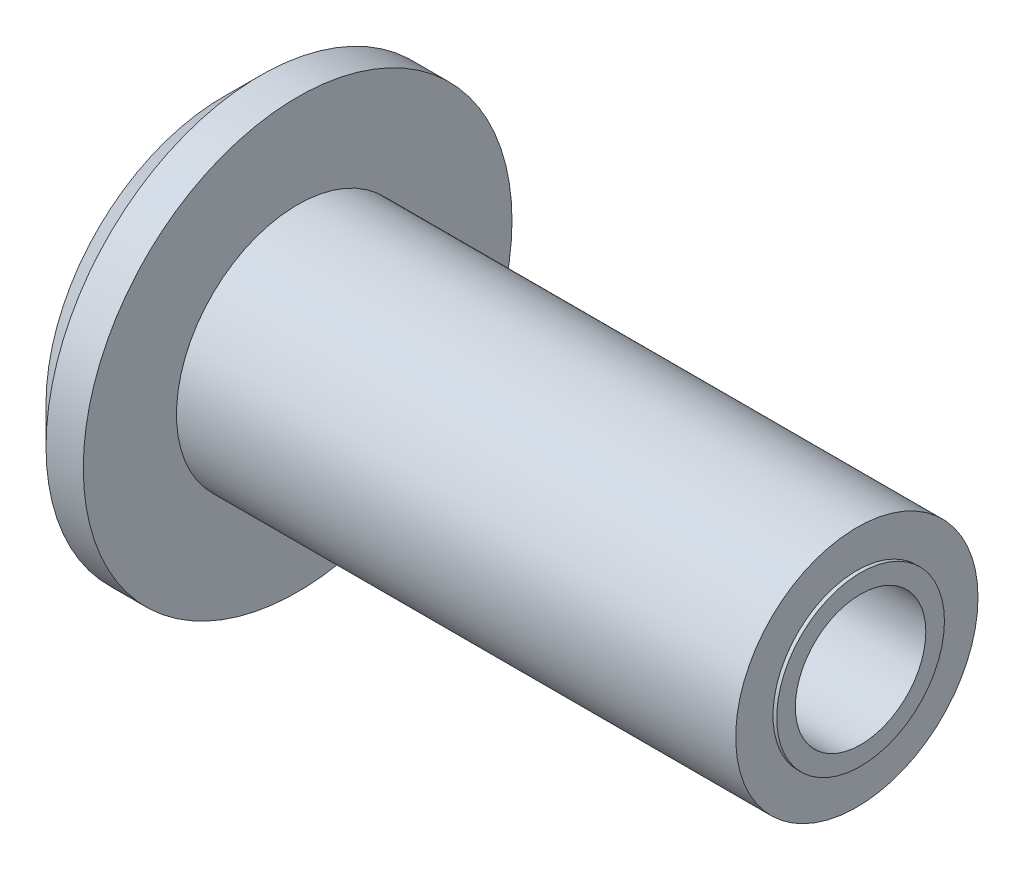
ISO-10303-21;
HEADER;
FILE_DESCRIPTION(('STEP AP214'),'2;1');
FILE_NAME('part.step','',(''),(''),'','','');
FILE_SCHEMA(('AUTOMOTIVE_DESIGN { 1 0 10303 214 1 1 1 1 }'));
ENDSEC;
DATA;
#1=APPLICATION_CONTEXT('core data for automotive mechanical design processes');
#2=APPLICATION_PROTOCOL_DEFINITION('international standard','automotive_design',2000,#1);
#3=PRODUCT_CONTEXT('',#1,'mechanical');
#4=PRODUCT('Part','Part','',(#3));
#5=PRODUCT_RELATED_PRODUCT_CATEGORY('part','',(#4));
#6=PRODUCT_DEFINITION_FORMATION('','',#4);
#7=PRODUCT_DEFINITION_CONTEXT('part definition',#1,'design');
#8=PRODUCT_DEFINITION('design','',#6,#7);
#9=PRODUCT_DEFINITION_SHAPE('','',#8);
#10=(LENGTH_UNIT() NAMED_UNIT(*) SI_UNIT(.MILLI.,.METRE.));
#11=(NAMED_UNIT(*) PLANE_ANGLE_UNIT() SI_UNIT($,.RADIAN.));
#12=(NAMED_UNIT(*) SI_UNIT($,.STERADIAN.) SOLID_ANGLE_UNIT());
#13=UNCERTAINTY_MEASURE_WITH_UNIT(LENGTH_MEASURE(1.E-05),#10,'distance_accuracy_value','');
#14=(GEOMETRIC_REPRESENTATION_CONTEXT(3) GLOBAL_UNCERTAINTY_ASSIGNED_CONTEXT((#13)) GLOBAL_UNIT_ASSIGNED_CONTEXT((#10,
#11,#12)) REPRESENTATION_CONTEXT('',''));
#15=CARTESIAN_POINT('',(0.,0.,0.));
#16=DIRECTION('',(0.,0.,1.));
#17=DIRECTION('',(1.,0.,0.));
#18=AXIS2_PLACEMENT_3D('',#15,#16,#17);
#19=CARTESIAN_POINT('',(30.,0.,0.));
#20=DIRECTION('',(1.,0.,0.));
#21=DIRECTION('',(0.,0.,-1.));
#22=AXIS2_PLACEMENT_3D('',#19,#20,#21);
#23=PLANE('',#22);
#24=CARTESIAN_POINT('',(30.,0.,0.));
#25=DIRECTION('',(1.,0.,0.));
#26=DIRECTION('',(0.,0.,-1.));
#27=AXIS2_PLACEMENT_3D('',#24,#25,#26);
#28=CIRCLE('',#27,6.5);
#29=CARTESIAN_POINT('',(30.,0.,-6.5));
#30=VERTEX_POINT('',#29);
#31=EDGE_CURVE('E55',#30,#30,#28,.T.);
#32=ORIENTED_EDGE('',*,*,#31,.T.);
#33=EDGE_LOOP('',(#32));
#34=FACE_BOUND('',#33,.T.);
#35=CARTESIAN_POINT('',(30.,0.,0.));
#36=DIRECTION('',(1.,0.,0.));
#37=DIRECTION('',(0.,0.,-1.));
#38=AXIS2_PLACEMENT_3D('',#35,#36,#37);
#39=CIRCLE('',#38,4.5);
#40=CARTESIAN_POINT('',(30.,0.,-4.5));
#41=VERTEX_POINT('',#40);
#42=EDGE_CURVE('E83',#41,#41,#39,.T.);
#43=ORIENTED_EDGE('',*,*,#42,.F.);
#44=EDGE_LOOP('',(#43));
#45=FACE_BOUND('',#44,.T.);
#46=ADVANCED_FACE('F41',(#34,#45),#23,.T.);
#47=CARTESIAN_POINT('',(30.,0.,0.));
#48=DIRECTION('',(-1.,0.,0.));
#49=DIRECTION('',(0.,0.,1.));
#50=AXIS2_PLACEMENT_3D('',#47,#48,#49);
#51=CYLINDRICAL_SURFACE('',#50,3.5);
#52=CARTESIAN_POINT('',(-2.,0.,0.));
#53=DIRECTION('',(-1.,0.,0.));
#54=DIRECTION('',(0.,0.,1.));
#55=AXIS2_PLACEMENT_3D('',#52,#53,#54);
#56=CIRCLE('',#55,3.5);
#57=CARTESIAN_POINT('',(-2.,0.,3.5));
#58=VERTEX_POINT('',#57);
#59=EDGE_CURVE('E63',#58,#58,#56,.T.);
#60=ORIENTED_EDGE('',*,*,#59,.T.);
#61=EDGE_LOOP('',(#60));
#62=FACE_BOUND('',#61,.T.);
#63=CARTESIAN_POINT('',(30.2,0.,0.));
#64=DIRECTION('',(1.,0.,0.));
#65=DIRECTION('',(0.,0.,-1.));
#66=AXIS2_PLACEMENT_3D('',#63,#64,#65);
#67=CIRCLE('',#66,3.5);
#68=CARTESIAN_POINT('',(30.2,0.,-3.5));
#69=VERTEX_POINT('',#68);
#70=EDGE_CURVE('E87',#69,#69,#67,.T.);
#71=ORIENTED_EDGE('',*,*,#70,.T.);
#72=EDGE_LOOP('',(#71));
#73=FACE_BOUND('',#72,.T.);
#74=ADVANCED_FACE('F95',(#62,#73),#51,.F.);
#75=CARTESIAN_POINT('',(30.,0.,0.));
#76=DIRECTION('',(-1.,0.,0.));
#77=DIRECTION('',(0.,0.,1.));
#78=AXIS2_PLACEMENT_3D('',#75,#76,#77);
#79=CYLINDRICAL_SURFACE('',#78,6.5);
#80=ORIENTED_EDGE('',*,*,#31,.F.);
#81=EDGE_LOOP('',(#80));
#82=FACE_BOUND('',#81,.T.);
#83=CARTESIAN_POINT('',(0.,0.,0.));
#84=DIRECTION('',(1.,0.,0.));
#85=DIRECTION('',(0.,0.,-1.));
#86=AXIS2_PLACEMENT_3D('',#83,#84,#85);
#87=CIRCLE('',#86,6.5);
#88=CARTESIAN_POINT('',(0.,0.,-6.5));
#89=VERTEX_POINT('',#88);
#90=EDGE_CURVE('E60',#89,#89,#87,.T.);
#91=ORIENTED_EDGE('',*,*,#90,.T.);
#92=EDGE_LOOP('',(#91));
#93=FACE_BOUND('',#92,.T.);
#94=ADVANCED_FACE('F116',(#82,#93),#79,.T.);
#95=CARTESIAN_POINT('',(-4.,0.,0.));
#96=DIRECTION('',(-1.,0.,0.));
#97=DIRECTION('',(0.,0.,1.));
#98=AXIS2_PLACEMENT_3D('',#95,#96,#97);
#99=PLANE('',#98);
#100=CARTESIAN_POINT('',(-4.,0.,0.));
#101=DIRECTION('',(-1.,0.,0.));
#102=DIRECTION('',(0.,0.,1.));
#103=AXIS2_PLACEMENT_3D('',#100,#101,#102);
#104=CIRCLE('',#103,9.49999999999999);
#105=CARTESIAN_POINT('',(-4.,0.,9.49999999999999));
#106=VERTEX_POINT('',#105);
#107=EDGE_CURVE('E50',#106,#106,#104,.T.);
#108=ORIENTED_EDGE('',*,*,#107,.T.);
#109=EDGE_LOOP('',(#108));
#110=FACE_BOUND('',#109,.T.);
#111=CARTESIAN_POINT('',(-4.,0.,0.));
#112=DIRECTION('',(-1.,0.,0.));
#113=DIRECTION('',(0.,0.,1.));
#114=AXIS2_PLACEMENT_3D('',#111,#112,#113);
#115=CIRCLE('',#114,6.75);
#116=CARTESIAN_POINT('',(-4.,0.,6.75));
#117=VERTEX_POINT('',#116);
#118=EDGE_CURVE('E75',#117,#117,#115,.T.);
#119=ORIENTED_EDGE('',*,*,#118,.F.);
#120=EDGE_LOOP('',(#119));
#121=FACE_BOUND('',#120,.T.);
#122=ADVANCED_FACE('F124',(#110,#121),#99,.T.);
#123=CARTESIAN_POINT('',(0.,0.,0.));
#124=DIRECTION('',(-1.,0.,0.));
#125=DIRECTION('',(0.,0.,1.));
#126=AXIS2_PLACEMENT_3D('',#123,#124,#125);
#127=PLANE('',#126);
#128=ORIENTED_EDGE('',*,*,#90,.F.);
#129=EDGE_LOOP('',(#128));
#130=FACE_BOUND('',#129,.T.);
#131=CARTESIAN_POINT('',(0.,0.,0.));
#132=DIRECTION('',(-1.,0.,0.));
#133=DIRECTION('',(0.,0.,1.));
#134=AXIS2_PLACEMENT_3D('',#131,#132,#133);
#135=CIRCLE('',#134,11.5);
#136=CARTESIAN_POINT('',(0.,0.,11.5));
#137=VERTEX_POINT('',#136);
#138=EDGE_CURVE('E67',#137,#137,#135,.T.);
#139=ORIENTED_EDGE('',*,*,#138,.F.);
#140=EDGE_LOOP('',(#139));
#141=FACE_BOUND('',#140,.T.);
#142=ADVANCED_FACE('F129',(#130,#141),#127,.F.);
#143=CARTESIAN_POINT('',(-4.,0.,0.));
#144=DIRECTION('',(1.,0.,0.));
#145=DIRECTION('',(0.,0.,-1.));
#146=AXIS2_PLACEMENT_3D('',#143,#144,#145);
#147=CYLINDRICAL_SURFACE('',#146,11.5);
#148=CARTESIAN_POINT('',(-2.,0.,0.));
#149=DIRECTION('',(-1.,0.,0.));
#150=DIRECTION('',(0.,0.,1.));
#151=AXIS2_PLACEMENT_3D('',#148,#149,#150);
#152=CIRCLE('',#151,11.5);
#153=CARTESIAN_POINT('',(-2.,0.,11.5));
#154=VERTEX_POINT('',#153);
#155=EDGE_CURVE('E10',#154,#154,#152,.F.);
#156=ORIENTED_EDGE('',*,*,#155,.T.);
#157=EDGE_LOOP('',(#156));
#158=FACE_BOUND('',#157,.T.);
#159=ORIENTED_EDGE('',*,*,#138,.T.);
#160=EDGE_LOOP('',(#159));
#161=FACE_BOUND('',#160,.T.);
#162=ADVANCED_FACE('F121',(#158,#161),#147,.T.);
#163=CARTESIAN_POINT('',(-2.,0.,0.));
#164=DIRECTION('',(-1.,0.,0.));
#165=DIRECTION('',(0.,0.,1.));
#166=AXIS2_PLACEMENT_3D('',#163,#164,#165);
#167=CYLINDRICAL_SURFACE('',#166,6.75);
#168=CARTESIAN_POINT('',(-2.,0.,0.));
#169=DIRECTION('',(-1.,0.,0.));
#170=DIRECTION('',(0.,0.,1.));
#171=AXIS2_PLACEMENT_3D('',#168,#169,#170);
#172=CIRCLE('',#171,6.75);
#173=CARTESIAN_POINT('',(-2.,0.,6.75));
#174=VERTEX_POINT('',#173);
#175=EDGE_CURVE('E68',#174,#174,#172,.T.);
#176=ORIENTED_EDGE('',*,*,#175,.F.);
#177=EDGE_LOOP('',(#176));
#178=FACE_BOUND('',#177,.T.);
#179=ORIENTED_EDGE('',*,*,#118,.T.);
#180=EDGE_LOOP('',(#179));
#181=FACE_BOUND('',#180,.T.);
#182=ADVANCED_FACE('F140',(#178,#181),#167,.F.);
#183=CARTESIAN_POINT('',(-2.,0.,0.));
#184=DIRECTION('',(-1.,0.,0.));
#185=DIRECTION('',(0.,0.,1.));
#186=AXIS2_PLACEMENT_3D('',#183,#184,#185);
#187=PLANE('',#186);
#188=ORIENTED_EDGE('',*,*,#59,.F.);
#189=EDGE_LOOP('',(#188));
#190=FACE_BOUND('',#189,.T.);
#191=ORIENTED_EDGE('',*,*,#175,.T.);
#192=EDGE_LOOP('',(#191));
#193=FACE_BOUND('',#192,.T.);
#194=ADVANCED_FACE('F108',(#190,#193),#187,.T.);
#195=CARTESIAN_POINT('',(-4.,0.,0.));
#196=DIRECTION('',(1.,0.,0.));
#197=DIRECTION('',(0.,0.,-1.));
#198=AXIS2_PLACEMENT_3D('',#195,#196,#197);
#199=CONICAL_SURFACE('',#198,9.49999999999999,0.785398163397449);
#200=ORIENTED_EDGE('',*,*,#155,.F.);
#201=EDGE_LOOP('',(#200));
#202=FACE_BOUND('',#201,.T.);
#203=ORIENTED_EDGE('',*,*,#107,.F.);
#204=EDGE_LOOP('',(#203));
#205=FACE_BOUND('',#204,.T.);
#206=ADVANCED_FACE('F44',(#202,#205),#199,.T.);
#207=CARTESIAN_POINT('',(30.2,0.,0.));
#208=DIRECTION('',(1.,0.,0.));
#209=DIRECTION('',(0.,0.,-1.));
#210=AXIS2_PLACEMENT_3D('',#207,#208,#209);
#211=PLANE('',#210);
#212=CARTESIAN_POINT('',(30.2,0.,0.));
#213=DIRECTION('',(1.,0.,0.));
#214=DIRECTION('',(0.,0.,-1.));
#215=AXIS2_PLACEMENT_3D('',#212,#213,#214);
#216=CIRCLE('',#215,4.5);
#217=CARTESIAN_POINT('',(30.2,0.,-4.5));
#218=VERTEX_POINT('',#217);
#219=EDGE_CURVE('E79',#218,#218,#216,.T.);
#220=ORIENTED_EDGE('',*,*,#219,.T.);
#221=EDGE_LOOP('',(#220));
#222=FACE_BOUND('',#221,.T.);
#223=ORIENTED_EDGE('',*,*,#70,.F.);
#224=EDGE_LOOP('',(#223));
#225=FACE_BOUND('',#224,.T.);
#226=ADVANCED_FACE('F97',(#222,#225),#211,.T.);
#227=CARTESIAN_POINT('',(30.2,0.,0.));
#228=DIRECTION('',(-1.,0.,0.));
#229=DIRECTION('',(0.,0.,1.));
#230=AXIS2_PLACEMENT_3D('',#227,#228,#229);
#231=CYLINDRICAL_SURFACE('',#230,4.5);
#232=ORIENTED_EDGE('',*,*,#219,.F.);
#233=EDGE_LOOP('',(#232));
#234=FACE_BOUND('',#233,.T.);
#235=ORIENTED_EDGE('',*,*,#42,.T.);
#236=EDGE_LOOP('',(#235));
#237=FACE_BOUND('',#236,.T.);
#238=ADVANCED_FACE('F99',(#234,#237),#231,.T.);
#239=CLOSED_SHELL('',(#46,#74,#94,#122,#142,#162,#182,#194,#206,#226,#238));
#240=MANIFOLD_SOLID_BREP('B2',#239);
#241=ADVANCED_BREP_SHAPE_REPRESENTATION('',(#18,#240),#14);
#242=SHAPE_DEFINITION_REPRESENTATION(#9,#241);
ENDSEC;
END-ISO-10303-21;
